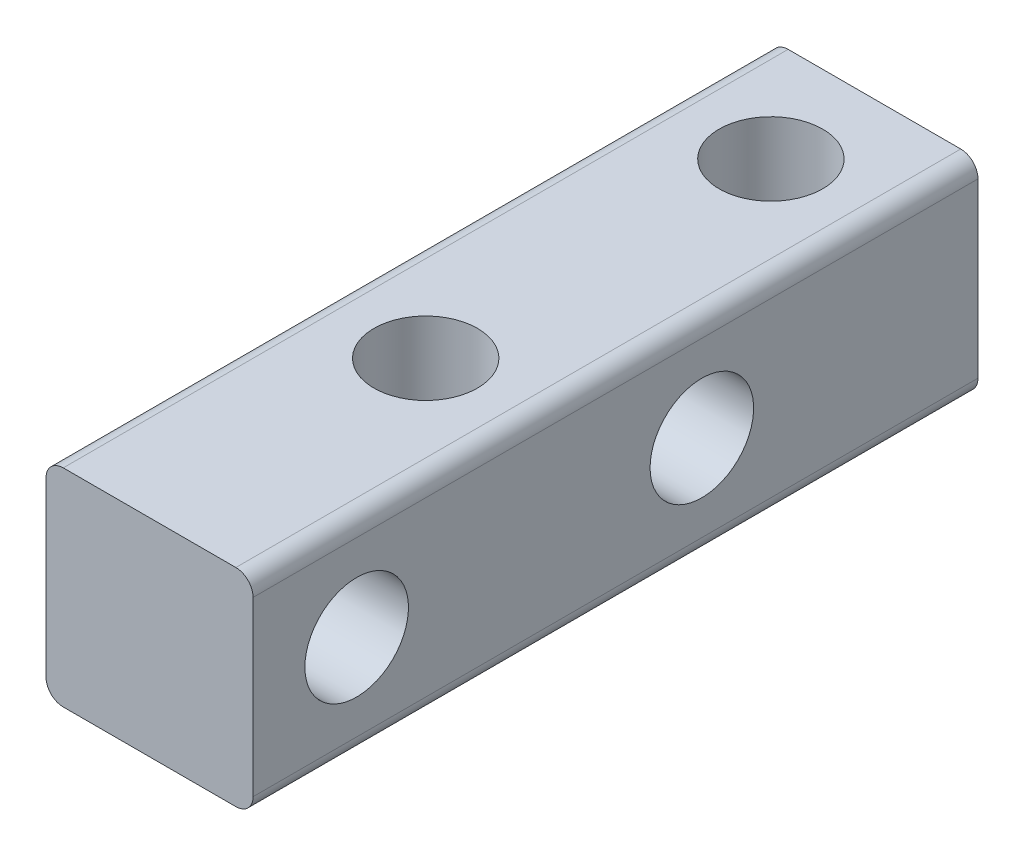
ISO-10303-21;
HEADER;
FILE_DESCRIPTION(('STEP AP214'),'2;1');
FILE_NAME('part.step','',(''),(''),'','','');
FILE_SCHEMA(('AUTOMOTIVE_DESIGN { 1 0 10303 214 1 1 1 1 }'));
ENDSEC;
DATA;
#1=APPLICATION_CONTEXT('core data for automotive mechanical design processes');
#2=APPLICATION_PROTOCOL_DEFINITION('international standard','automotive_design',2000,#1);
#3=PRODUCT_CONTEXT('',#1,'mechanical');
#4=PRODUCT('Part','Part','',(#3));
#5=PRODUCT_RELATED_PRODUCT_CATEGORY('part','',(#4));
#6=PRODUCT_DEFINITION_FORMATION('','',#4);
#7=PRODUCT_DEFINITION_CONTEXT('part definition',#1,'design');
#8=PRODUCT_DEFINITION('design','',#6,#7);
#9=PRODUCT_DEFINITION_SHAPE('','',#8);
#10=(LENGTH_UNIT() NAMED_UNIT(*) SI_UNIT(.MILLI.,.METRE.));
#11=(NAMED_UNIT(*) PLANE_ANGLE_UNIT() SI_UNIT($,.RADIAN.));
#12=(NAMED_UNIT(*) SI_UNIT($,.STERADIAN.) SOLID_ANGLE_UNIT());
#13=UNCERTAINTY_MEASURE_WITH_UNIT(LENGTH_MEASURE(1.E-05),#10,'distance_accuracy_value','');
#14=(GEOMETRIC_REPRESENTATION_CONTEXT(3) GLOBAL_UNCERTAINTY_ASSIGNED_CONTEXT((#13)) GLOBAL_UNIT_ASSIGNED_CONTEXT((#10,
#11,#12)) REPRESENTATION_CONTEXT('',''));
#15=CARTESIAN_POINT('',(0.,0.,0.));
#16=DIRECTION('',(0.,0.,1.));
#17=DIRECTION('',(1.,0.,0.));
#18=AXIS2_PLACEMENT_3D('',#15,#16,#17);
#19=CARTESIAN_POINT('',(3.,-3.,21.));
#20=DIRECTION('',(-1.,0.,0.));
#21=DIRECTION('',(0.,0.,1.));
#22=AXIS2_PLACEMENT_3D('',#19,#20,#21);
#23=PLANE('',#22);
#24=CARTESIAN_POINT('',(3.,0.,18.));
#25=DIRECTION('',(-1.,0.,0.));
#26=DIRECTION('',(0.,0.,1.));
#27=AXIS2_PLACEMENT_3D('',#24,#25,#26);
#28=CIRCLE('',#27,1.5);
#29=CARTESIAN_POINT('',(3.,0.,19.5));
#30=VERTEX_POINT('',#29);
#31=EDGE_CURVE('E160',#30,#30,#28,.F.);
#32=ORIENTED_EDGE('',*,*,#31,.F.);
#33=EDGE_LOOP('',(#32));
#34=FACE_BOUND('',#33,.T.);
#35=CARTESIAN_POINT('',(3.,0.,8.));
#36=DIRECTION('',(-1.,0.,0.));
#37=DIRECTION('',(0.,0.,1.));
#38=AXIS2_PLACEMENT_3D('',#35,#36,#37);
#39=CIRCLE('',#38,1.5);
#40=CARTESIAN_POINT('',(3.,0.,9.5));
#41=VERTEX_POINT('',#40);
#42=EDGE_CURVE('E166',#41,#41,#39,.F.);
#43=ORIENTED_EDGE('',*,*,#42,.F.);
#44=EDGE_LOOP('',(#43));
#45=FACE_BOUND('',#44,.T.);
#46=DIRECTION('',(0.,1.,0.));
#47=VECTOR('',#46,1.);
#48=CARTESIAN_POINT('',(3.,-3.,21.));
#49=LINE('',#48,#47);
#50=CARTESIAN_POINT('',(3.,-2.5,21.));
#51=VERTEX_POINT('',#50);
#52=CARTESIAN_POINT('',(3.,2.5,21.));
#53=VERTEX_POINT('',#52);
#54=EDGE_CURVE('E134',#51,#53,#49,.T.);
#55=ORIENTED_EDGE('',*,*,#54,.F.);
#56=DIRECTION('',(0.,0.,-1.));
#57=VECTOR('',#56,1.);
#58=CARTESIAN_POINT('',(3.,-2.5,21.));
#59=LINE('',#58,#57);
#60=CARTESIAN_POINT('',(3.,-2.5,0.));
#61=VERTEX_POINT('',#60);
#62=EDGE_CURVE('E119',#51,#61,#59,.T.);
#63=ORIENTED_EDGE('',*,*,#62,.T.);
#64=DIRECTION('',(0.,1.,0.));
#65=VECTOR('',#64,1.);
#66=CARTESIAN_POINT('',(3.,-3.,0.));
#67=LINE('',#66,#65);
#68=CARTESIAN_POINT('',(3.,2.5,0.));
#69=VERTEX_POINT('',#68);
#70=EDGE_CURVE('E131',#61,#69,#67,.T.);
#71=ORIENTED_EDGE('',*,*,#70,.T.);
#72=DIRECTION('',(0.,0.,-1.));
#73=VECTOR('',#72,1.);
#74=CARTESIAN_POINT('',(3.,2.5,21.));
#75=LINE('',#74,#73);
#76=EDGE_CURVE('E136',#69,#53,#75,.F.);
#77=ORIENTED_EDGE('',*,*,#76,.T.);
#78=EDGE_LOOP('',(#55,#63,#71,#77));
#79=FACE_BOUND('',#78,.T.);
#80=ADVANCED_FACE('F49',(#34,#45,#79),#23,.F.);
#81=CARTESIAN_POINT('',(-3.,3.,21.));
#82=DIRECTION('',(0.,-1.,0.));
#83=DIRECTION('',(0.,0.,-1.));
#84=AXIS2_PLACEMENT_3D('',#81,#82,#83);
#85=PLANE('',#84);
#86=CARTESIAN_POINT('',(0.,3.,3.));
#87=DIRECTION('',(0.,-1.,0.));
#88=DIRECTION('',(0.,0.,-1.));
#89=AXIS2_PLACEMENT_3D('',#86,#87,#88);
#90=CIRCLE('',#89,1.5);
#91=CARTESIAN_POINT('',(0.,3.,1.5));
#92=VERTEX_POINT('',#91);
#93=EDGE_CURVE('E141',#92,#92,#90,.F.);
#94=ORIENTED_EDGE('',*,*,#93,.F.);
#95=EDGE_LOOP('',(#94));
#96=FACE_BOUND('',#95,.T.);
#97=CARTESIAN_POINT('',(0.,3.,13.));
#98=DIRECTION('',(0.,-1.,0.));
#99=DIRECTION('',(0.,0.,-1.));
#100=AXIS2_PLACEMENT_3D('',#97,#98,#99);
#101=CIRCLE('',#100,1.5);
#102=CARTESIAN_POINT('',(0.,3.,11.5));
#103=VERTEX_POINT('',#102);
#104=EDGE_CURVE('E159',#103,#103,#101,.F.);
#105=ORIENTED_EDGE('',*,*,#104,.F.);
#106=EDGE_LOOP('',(#105));
#107=FACE_BOUND('',#106,.T.);
#108=DIRECTION('',(-1.,0.,0.));
#109=VECTOR('',#108,1.);
#110=CARTESIAN_POINT('',(-3.,3.,0.));
#111=LINE('',#110,#109);
#112=CARTESIAN_POINT('',(2.5,3.,0.));
#113=VERTEX_POINT('',#112);
#114=CARTESIAN_POINT('',(-2.5,3.,0.));
#115=VERTEX_POINT('',#114);
#116=EDGE_CURVE('E140',#113,#115,#111,.T.);
#117=ORIENTED_EDGE('',*,*,#116,.T.);
#118=DIRECTION('',(0.,0.,-1.));
#119=VECTOR('',#118,1.);
#120=CARTESIAN_POINT('',(-2.5,3.,21.));
#121=LINE('',#120,#119);
#122=CARTESIAN_POINT('',(-2.5,3.,21.));
#123=VERTEX_POINT('',#122);
#124=EDGE_CURVE('E11',#115,#123,#121,.F.);
#125=ORIENTED_EDGE('',*,*,#124,.T.);
#126=DIRECTION('',(-1.,0.,0.));
#127=VECTOR('',#126,1.);
#128=CARTESIAN_POINT('',(-3.,3.,21.));
#129=LINE('',#128,#127);
#130=CARTESIAN_POINT('',(2.5,3.,21.));
#131=VERTEX_POINT('',#130);
#132=EDGE_CURVE('E194',#131,#123,#129,.T.);
#133=ORIENTED_EDGE('',*,*,#132,.F.);
#134=DIRECTION('',(0.,0.,-1.));
#135=VECTOR('',#134,1.);
#136=CARTESIAN_POINT('',(2.5,3.,21.));
#137=LINE('',#136,#135);
#138=EDGE_CURVE('E57',#131,#113,#137,.T.);
#139=ORIENTED_EDGE('',*,*,#138,.T.);
#140=EDGE_LOOP('',(#117,#125,#133,#139));
#141=FACE_BOUND('',#140,.T.);
#142=ADVANCED_FACE('F192',(#96,#107,#141),#85,.F.);
#143=CARTESIAN_POINT('',(-3.,-3.,21.));
#144=DIRECTION('',(1.,0.,0.));
#145=DIRECTION('',(0.,0.,-1.));
#146=AXIS2_PLACEMENT_3D('',#143,#144,#145);
#147=PLANE('',#146);
#148=CARTESIAN_POINT('',(-3.,0.,18.));
#149=DIRECTION('',(1.,0.,0.));
#150=DIRECTION('',(0.,0.,-1.));
#151=AXIS2_PLACEMENT_3D('',#148,#149,#150);
#152=CIRCLE('',#151,1.5);
#153=CARTESIAN_POINT('',(-3.,0.,19.5));
#154=VERTEX_POINT('',#153);
#155=EDGE_CURVE('E167',#154,#154,#152,.F.);
#156=ORIENTED_EDGE('',*,*,#155,.F.);
#157=EDGE_LOOP('',(#156));
#158=FACE_BOUND('',#157,.T.);
#159=CARTESIAN_POINT('',(-3.,0.,8.));
#160=DIRECTION('',(1.,0.,0.));
#161=DIRECTION('',(0.,0.,-1.));
#162=AXIS2_PLACEMENT_3D('',#159,#160,#161);
#163=CIRCLE('',#162,1.5);
#164=CARTESIAN_POINT('',(-3.,0.,9.5));
#165=VERTEX_POINT('',#164);
#166=EDGE_CURVE('E163',#165,#165,#163,.F.);
#167=ORIENTED_EDGE('',*,*,#166,.F.);
#168=EDGE_LOOP('',(#167));
#169=FACE_BOUND('',#168,.T.);
#170=DIRECTION('',(0.,-1.,0.));
#171=VECTOR('',#170,1.);
#172=CARTESIAN_POINT('',(-3.,-3.,0.));
#173=LINE('',#172,#171);
#174=CARTESIAN_POINT('',(-3.,2.5,0.));
#175=VERTEX_POINT('',#174);
#176=CARTESIAN_POINT('',(-3.,-2.5,0.));
#177=VERTEX_POINT('',#176);
#178=EDGE_CURVE('E144',#175,#177,#173,.T.);
#179=ORIENTED_EDGE('',*,*,#178,.T.);
#180=DIRECTION('',(0.,0.,-1.));
#181=VECTOR('',#180,1.);
#182=CARTESIAN_POINT('',(-3.,-2.5,21.));
#183=LINE('',#182,#181);
#184=CARTESIAN_POINT('',(-3.,-2.5,21.));
#185=VERTEX_POINT('',#184);
#186=EDGE_CURVE('E64',#177,#185,#183,.F.);
#187=ORIENTED_EDGE('',*,*,#186,.T.);
#188=DIRECTION('',(0.,-1.,0.));
#189=VECTOR('',#188,1.);
#190=CARTESIAN_POINT('',(-3.,-3.,21.));
#191=LINE('',#190,#189);
#192=CARTESIAN_POINT('',(-3.,2.5,21.));
#193=VERTEX_POINT('',#192);
#194=EDGE_CURVE('E202',#193,#185,#191,.T.);
#195=ORIENTED_EDGE('',*,*,#194,.F.);
#196=DIRECTION('',(0.,0.,-1.));
#197=VECTOR('',#196,1.);
#198=CARTESIAN_POINT('',(-3.,2.5,21.));
#199=LINE('',#198,#197);
#200=EDGE_CURVE('E185',#193,#175,#199,.T.);
#201=ORIENTED_EDGE('',*,*,#200,.T.);
#202=EDGE_LOOP('',(#179,#187,#195,#201));
#203=FACE_BOUND('',#202,.T.);
#204=ADVANCED_FACE('F201',(#158,#169,#203),#147,.F.);
#205=CARTESIAN_POINT('',(-3.,-3.,21.));
#206=DIRECTION('',(0.,1.,0.));
#207=DIRECTION('',(0.,0.,1.));
#208=AXIS2_PLACEMENT_3D('',#205,#206,#207);
#209=PLANE('',#208);
#210=CARTESIAN_POINT('',(0.,-3.,3.));
#211=DIRECTION('',(0.,1.,0.));
#212=DIRECTION('',(0.,0.,1.));
#213=AXIS2_PLACEMENT_3D('',#210,#211,#212);
#214=CIRCLE('',#213,1.5);
#215=CARTESIAN_POINT('',(0.,-3.,1.5));
#216=VERTEX_POINT('',#215);
#217=EDGE_CURVE('E147',#216,#216,#214,.F.);
#218=ORIENTED_EDGE('',*,*,#217,.F.);
#219=EDGE_LOOP('',(#218));
#220=FACE_BOUND('',#219,.T.);
#221=CARTESIAN_POINT('',(0.,-3.,13.));
#222=DIRECTION('',(0.,1.,0.));
#223=DIRECTION('',(0.,0.,1.));
#224=AXIS2_PLACEMENT_3D('',#221,#222,#223);
#225=CIRCLE('',#224,1.5);
#226=CARTESIAN_POINT('',(0.,-3.,11.5));
#227=VERTEX_POINT('',#226);
#228=EDGE_CURVE('E156',#227,#227,#225,.F.);
#229=ORIENTED_EDGE('',*,*,#228,.F.);
#230=EDGE_LOOP('',(#229));
#231=FACE_BOUND('',#230,.T.);
#232=DIRECTION('',(1.,0.,0.));
#233=VECTOR('',#232,1.);
#234=CARTESIAN_POINT('',(-3.,-3.,0.));
#235=LINE('',#234,#233);
#236=CARTESIAN_POINT('',(-2.5,-3.,0.));
#237=VERTEX_POINT('',#236);
#238=CARTESIAN_POINT('',(2.5,-3.,0.));
#239=VERTEX_POINT('',#238);
#240=EDGE_CURVE('E154',#237,#239,#235,.T.);
#241=ORIENTED_EDGE('',*,*,#240,.T.);
#242=DIRECTION('',(0.,0.,-1.));
#243=VECTOR('',#242,1.);
#244=CARTESIAN_POINT('',(2.5,-3.,21.));
#245=LINE('',#244,#243);
#246=CARTESIAN_POINT('',(2.5,-3.,21.));
#247=VERTEX_POINT('',#246);
#248=EDGE_CURVE('E120',#239,#247,#245,.F.);
#249=ORIENTED_EDGE('',*,*,#248,.T.);
#250=DIRECTION('',(1.,0.,0.));
#251=VECTOR('',#250,1.);
#252=CARTESIAN_POINT('',(-3.,-3.,21.));
#253=LINE('',#252,#251);
#254=CARTESIAN_POINT('',(-2.5,-3.,21.));
#255=VERTEX_POINT('',#254);
#256=EDGE_CURVE('E150',#255,#247,#253,.T.);
#257=ORIENTED_EDGE('',*,*,#256,.F.);
#258=DIRECTION('',(0.,0.,-1.));
#259=VECTOR('',#258,1.);
#260=CARTESIAN_POINT('',(-2.5,-3.,21.));
#261=LINE('',#260,#259);
#262=EDGE_CURVE('E125',#255,#237,#261,.T.);
#263=ORIENTED_EDGE('',*,*,#262,.T.);
#264=EDGE_LOOP('',(#241,#249,#257,#263));
#265=FACE_BOUND('',#264,.T.);
#266=ADVANCED_FACE('F245',(#220,#231,#265),#209,.F.);
#267=CARTESIAN_POINT('',(0.,0.,21.));
#268=DIRECTION('',(0.,0.,-1.));
#269=DIRECTION('',(-1.,0.,0.));
#270=AXIS2_PLACEMENT_3D('',#267,#268,#269);
#271=PLANE('',#270);
#272=ORIENTED_EDGE('',*,*,#256,.T.);
#273=CARTESIAN_POINT('',(2.5,-2.5,21.));
#274=DIRECTION('',(0.,0.,-1.));
#275=DIRECTION('',(-1.,0.,0.));
#276=AXIS2_PLACEMENT_3D('',#273,#274,#275);
#277=CIRCLE('',#276,0.5);
#278=EDGE_CURVE('E183',#247,#51,#277,.F.);
#279=ORIENTED_EDGE('',*,*,#278,.T.);
#280=ORIENTED_EDGE('',*,*,#54,.T.);
#281=CARTESIAN_POINT('',(2.5,2.5,21.));
#282=DIRECTION('',(0.,0.,-1.));
#283=DIRECTION('',(-1.,0.,0.));
#284=AXIS2_PLACEMENT_3D('',#281,#282,#283);
#285=CIRCLE('',#284,0.5);
#286=EDGE_CURVE('E178',#53,#131,#285,.F.);
#287=ORIENTED_EDGE('',*,*,#286,.T.);
#288=ORIENTED_EDGE('',*,*,#132,.T.);
#289=CARTESIAN_POINT('',(-2.5,2.5,21.));
#290=DIRECTION('',(0.,0.,-1.));
#291=DIRECTION('',(-1.,0.,0.));
#292=AXIS2_PLACEMENT_3D('',#289,#290,#291);
#293=CIRCLE('',#292,0.5);
#294=EDGE_CURVE('E71',#123,#193,#293,.F.);
#295=ORIENTED_EDGE('',*,*,#294,.T.);
#296=ORIENTED_EDGE('',*,*,#194,.T.);
#297=CARTESIAN_POINT('',(-2.5,-2.5,21.));
#298=DIRECTION('',(0.,0.,-1.));
#299=DIRECTION('',(-1.,0.,0.));
#300=AXIS2_PLACEMENT_3D('',#297,#298,#299);
#301=CIRCLE('',#300,0.5);
#302=EDGE_CURVE('E181',#185,#255,#301,.F.);
#303=ORIENTED_EDGE('',*,*,#302,.T.);
#304=EDGE_LOOP('',(#272,#279,#280,#287,#288,#295,#296,#303));
#305=FACE_BOUND('',#304,.T.);
#306=ADVANCED_FACE('F241',(#305),#271,.F.);
#307=CARTESIAN_POINT('',(0.,0.,0.));
#308=DIRECTION('',(0.,0.,-1.));
#309=DIRECTION('',(-1.,0.,0.));
#310=AXIS2_PLACEMENT_3D('',#307,#308,#309);
#311=PLANE('',#310);
#312=ORIENTED_EDGE('',*,*,#70,.F.);
#313=CARTESIAN_POINT('',(2.5,-2.5,0.));
#314=DIRECTION('',(0.,0.,-1.));
#315=DIRECTION('',(-1.,0.,0.));
#316=AXIS2_PLACEMENT_3D('',#313,#314,#315);
#317=CIRCLE('',#316,0.5);
#318=EDGE_CURVE('E115',#61,#239,#317,.T.);
#319=ORIENTED_EDGE('',*,*,#318,.T.);
#320=ORIENTED_EDGE('',*,*,#240,.F.);
#321=CARTESIAN_POINT('',(-2.5,-2.5,0.));
#322=DIRECTION('',(0.,0.,-1.));
#323=DIRECTION('',(-1.,0.,0.));
#324=AXIS2_PLACEMENT_3D('',#321,#322,#323);
#325=CIRCLE('',#324,0.5);
#326=EDGE_CURVE('E126',#237,#177,#325,.T.);
#327=ORIENTED_EDGE('',*,*,#326,.T.);
#328=ORIENTED_EDGE('',*,*,#178,.F.);
#329=CARTESIAN_POINT('',(-2.5,2.5,0.));
#330=DIRECTION('',(0.,0.,-1.));
#331=DIRECTION('',(-1.,0.,0.));
#332=AXIS2_PLACEMENT_3D('',#329,#330,#331);
#333=CIRCLE('',#332,0.5);
#334=EDGE_CURVE('E172',#175,#115,#333,.T.);
#335=ORIENTED_EDGE('',*,*,#334,.T.);
#336=ORIENTED_EDGE('',*,*,#116,.F.);
#337=CARTESIAN_POINT('',(2.5,2.5,0.));
#338=DIRECTION('',(0.,0.,-1.));
#339=DIRECTION('',(-1.,0.,0.));
#340=AXIS2_PLACEMENT_3D('',#337,#338,#339);
#341=CIRCLE('',#340,0.5);
#342=EDGE_CURVE('E135',#113,#69,#341,.T.);
#343=ORIENTED_EDGE('',*,*,#342,.T.);
#344=EDGE_LOOP('',(#312,#319,#320,#327,#328,#335,#336,#343));
#345=FACE_BOUND('',#344,.T.);
#346=ADVANCED_FACE('F138',(#345),#311,.T.);
#347=CARTESIAN_POINT('',(0.,21.,13.));
#348=DIRECTION('',(0.,-1.,0.));
#349=DIRECTION('',(0.,0.,-1.));
#350=AXIS2_PLACEMENT_3D('',#347,#348,#349);
#351=CYLINDRICAL_SURFACE('',#350,1.5);
#352=CARTESIAN_POINT('',(0.,-3.,11.5));
#353=CARTESIAN_POINT('',(0.,-2.9375,11.5));
#354=CARTESIAN_POINT('',(0.,-2.875,11.5));
#355=CARTESIAN_POINT('',(0.,-2.75,11.5));
#356=CARTESIAN_POINT('',(0.,-2.6875,11.5));
#357=CARTESIAN_POINT('',(0.,-2.5625,11.5));
#358=CARTESIAN_POINT('',(0.,-2.5,11.5));
#359=CARTESIAN_POINT('',(0.,-2.375,11.5));
#360=CARTESIAN_POINT('',(0.,-2.3125,11.5));
#361=CARTESIAN_POINT('',(0.,-2.1875,11.5));
#362=CARTESIAN_POINT('',(0.,-2.125,11.5));
#363=CARTESIAN_POINT('',(0.,-2.,11.5));
#364=CARTESIAN_POINT('',(0.,-1.9375,11.5));
#365=CARTESIAN_POINT('',(0.,-1.8125,11.5));
#366=CARTESIAN_POINT('',(0.,-1.75,11.5));
#367=CARTESIAN_POINT('',(0.,-1.625,11.5));
#368=CARTESIAN_POINT('',(0.,-1.5625,11.5));
#369=CARTESIAN_POINT('',(0.,-1.4375,11.5));
#370=CARTESIAN_POINT('',(0.,-1.375,11.5));
#371=CARTESIAN_POINT('',(0.,-1.25,11.5));
#372=CARTESIAN_POINT('',(0.,-1.1875,11.5));
#373=CARTESIAN_POINT('',(0.,-1.0625,11.5));
#374=CARTESIAN_POINT('',(0.,-1.,11.5));
#375=CARTESIAN_POINT('',(0.,-0.875000000000001,11.5));
#376=CARTESIAN_POINT('',(0.,-0.812500000000001,11.5));
#377=CARTESIAN_POINT('',(0.,-0.687500000000001,11.5));
#378=CARTESIAN_POINT('',(0.,-0.625000000000001,11.5));
#379=CARTESIAN_POINT('',(0.,-0.5,11.5));
#380=CARTESIAN_POINT('',(0.,-0.4375,11.5));
#381=CARTESIAN_POINT('',(0.,-0.3125,11.5));
#382=CARTESIAN_POINT('',(0.,-0.25,11.5));
#383=CARTESIAN_POINT('',(0.,-0.125,11.5));
#384=CARTESIAN_POINT('',(0.,-0.0625000000000001,11.5));
#385=CARTESIAN_POINT('',(0.,0.0625000000000001,11.5));
#386=CARTESIAN_POINT('',(0.,0.125,11.5));
#387=CARTESIAN_POINT('',(0.,0.25,11.5));
#388=CARTESIAN_POINT('',(0.,0.3125,11.5));
#389=CARTESIAN_POINT('',(0.,0.4375,11.5));
#390=CARTESIAN_POINT('',(0.,0.5,11.5));
#391=CARTESIAN_POINT('',(0.,0.625000000000001,11.5));
#392=CARTESIAN_POINT('',(0.,0.687500000000001,11.5));
#393=CARTESIAN_POINT('',(0.,0.812500000000001,11.5));
#394=CARTESIAN_POINT('',(0.,0.875000000000001,11.5));
#395=CARTESIAN_POINT('',(0.,1.,11.5));
#396=CARTESIAN_POINT('',(0.,1.0625,11.5));
#397=CARTESIAN_POINT('',(0.,1.1875,11.5));
#398=CARTESIAN_POINT('',(0.,1.25,11.5));
#399=CARTESIAN_POINT('',(0.,1.375,11.5));
#400=CARTESIAN_POINT('',(0.,1.4375,11.5));
#401=CARTESIAN_POINT('',(0.,1.5625,11.5));
#402=CARTESIAN_POINT('',(0.,1.625,11.5));
#403=CARTESIAN_POINT('',(0.,1.75,11.5));
#404=CARTESIAN_POINT('',(0.,1.8125,11.5));
#405=CARTESIAN_POINT('',(0.,1.9375,11.5));
#406=CARTESIAN_POINT('',(0.,2.,11.5));
#407=CARTESIAN_POINT('',(0.,2.125,11.5));
#408=CARTESIAN_POINT('',(0.,2.1875,11.5));
#409=CARTESIAN_POINT('',(0.,2.3125,11.5));
#410=CARTESIAN_POINT('',(0.,2.375,11.5));
#411=CARTESIAN_POINT('',(0.,2.5,11.5));
#412=CARTESIAN_POINT('',(0.,2.5625,11.5));
#413=CARTESIAN_POINT('',(0.,2.6875,11.5));
#414=CARTESIAN_POINT('',(0.,2.75,11.5));
#415=CARTESIAN_POINT('',(0.,2.875,11.5));
#416=CARTESIAN_POINT('',(0.,2.9375,11.5));
#417=CARTESIAN_POINT('',(0.,3.,11.5));
#418=B_SPLINE_CURVE_WITH_KNOTS('',3,(#352,#353,#354,#355,#356,#357,#358,#359,#360,#361,#362,
#363,#364,#365,#366,#367,#368,#369,#370,#371,#372,#373,#374,#375,#376,#377,#378,#379,#380,#381,
#382,#383,#384,#385,#386,#387,#388,#389,#390,#391,#392,#393,#394,#395,#396,#397,#398,#399,#400,
#401,#402,#403,#404,#405,#406,#407,#408,#409,#410,#411,#412,#413,#414,#415,#416,#417),
.UNSPECIFIED.,.F.,.F.,(4,2,2,2,2,2,2,2,2,2,2,2,2,2,2,2,2,2,2,2,2,2,2,2,2,2,2,2,2,2,2,2,4),(0.,
0.1875,0.375,0.5625,0.750000000000001,0.937500000000001,1.125,1.3125,1.5,1.6875,1.875,2.0625,
2.25,2.4375,2.625,2.8125,3.,3.1875,3.375,3.5625,3.75,3.9375,4.125,4.3125,4.5,4.6875,4.875,
5.0625,5.25,5.4375,5.62500000000001,5.81250000000001,6.00000000000001),.UNSPECIFIED.);
#419=EDGE_CURVE('BSEAM259',#227,#103,#418,.T.);
#420=ORIENTED_EDGE('',*,*,#228,.T.);
#421=ORIENTED_EDGE('',*,*,#104,.T.);
#422=ORIENTED_EDGE('',*,*,#419,.T.);
#423=ORIENTED_EDGE('',*,*,#419,.F.);
#424=EDGE_LOOP('',(#420,#422,#421,#423));
#425=FACE_BOUND('',#424,.T.);
#426=ADVANCED_FACE('F259',(#425),#351,.F.);
#427=CARTESIAN_POINT('',(0.,21.,3.));
#428=DIRECTION('',(0.,-1.,0.));
#429=DIRECTION('',(0.,0.,-1.));
#430=AXIS2_PLACEMENT_3D('',#427,#428,#429);
#431=CYLINDRICAL_SURFACE('',#430,1.5);
#432=CARTESIAN_POINT('',(0.,-3.,1.5));
#433=CARTESIAN_POINT('',(0.,-2.9375,1.5));
#434=CARTESIAN_POINT('',(0.,-2.875,1.5));
#435=CARTESIAN_POINT('',(0.,-2.75,1.5));
#436=CARTESIAN_POINT('',(0.,-2.6875,1.5));
#437=CARTESIAN_POINT('',(0.,-2.5625,1.5));
#438=CARTESIAN_POINT('',(0.,-2.5,1.5));
#439=CARTESIAN_POINT('',(0.,-2.375,1.5));
#440=CARTESIAN_POINT('',(0.,-2.3125,1.5));
#441=CARTESIAN_POINT('',(0.,-2.1875,1.5));
#442=CARTESIAN_POINT('',(0.,-2.125,1.5));
#443=CARTESIAN_POINT('',(0.,-2.,1.5));
#444=CARTESIAN_POINT('',(0.,-1.9375,1.5));
#445=CARTESIAN_POINT('',(0.,-1.8125,1.5));
#446=CARTESIAN_POINT('',(0.,-1.75,1.5));
#447=CARTESIAN_POINT('',(0.,-1.625,1.5));
#448=CARTESIAN_POINT('',(0.,-1.5625,1.5));
#449=CARTESIAN_POINT('',(0.,-1.4375,1.5));
#450=CARTESIAN_POINT('',(0.,-1.375,1.5));
#451=CARTESIAN_POINT('',(0.,-1.25,1.5));
#452=CARTESIAN_POINT('',(0.,-1.1875,1.5));
#453=CARTESIAN_POINT('',(0.,-1.0625,1.5));
#454=CARTESIAN_POINT('',(0.,-1.,1.5));
#455=CARTESIAN_POINT('',(0.,-0.875000000000001,1.5));
#456=CARTESIAN_POINT('',(0.,-0.812500000000001,1.5));
#457=CARTESIAN_POINT('',(0.,-0.687500000000001,1.5));
#458=CARTESIAN_POINT('',(0.,-0.625000000000001,1.5));
#459=CARTESIAN_POINT('',(0.,-0.5,1.5));
#460=CARTESIAN_POINT('',(0.,-0.4375,1.5));
#461=CARTESIAN_POINT('',(0.,-0.3125,1.5));
#462=CARTESIAN_POINT('',(0.,-0.25,1.5));
#463=CARTESIAN_POINT('',(0.,-0.125,1.5));
#464=CARTESIAN_POINT('',(0.,-0.0625000000000001,1.5));
#465=CARTESIAN_POINT('',(0.,0.0625000000000001,1.5));
#466=CARTESIAN_POINT('',(0.,0.125,1.5));
#467=CARTESIAN_POINT('',(0.,0.25,1.5));
#468=CARTESIAN_POINT('',(0.,0.3125,1.5));
#469=CARTESIAN_POINT('',(0.,0.4375,1.5));
#470=CARTESIAN_POINT('',(0.,0.5,1.5));
#471=CARTESIAN_POINT('',(0.,0.625000000000001,1.5));
#472=CARTESIAN_POINT('',(0.,0.687500000000001,1.5));
#473=CARTESIAN_POINT('',(0.,0.812500000000001,1.5));
#474=CARTESIAN_POINT('',(0.,0.875000000000001,1.5));
#475=CARTESIAN_POINT('',(0.,1.,1.5));
#476=CARTESIAN_POINT('',(0.,1.0625,1.5));
#477=CARTESIAN_POINT('',(0.,1.1875,1.5));
#478=CARTESIAN_POINT('',(0.,1.25,1.5));
#479=CARTESIAN_POINT('',(0.,1.375,1.5));
#480=CARTESIAN_POINT('',(0.,1.4375,1.5));
#481=CARTESIAN_POINT('',(0.,1.5625,1.5));
#482=CARTESIAN_POINT('',(0.,1.625,1.5));
#483=CARTESIAN_POINT('',(0.,1.75,1.5));
#484=CARTESIAN_POINT('',(0.,1.8125,1.5));
#485=CARTESIAN_POINT('',(0.,1.9375,1.5));
#486=CARTESIAN_POINT('',(0.,2.,1.5));
#487=CARTESIAN_POINT('',(0.,2.125,1.5));
#488=CARTESIAN_POINT('',(0.,2.1875,1.5));
#489=CARTESIAN_POINT('',(0.,2.3125,1.5));
#490=CARTESIAN_POINT('',(0.,2.375,1.5));
#491=CARTESIAN_POINT('',(0.,2.5,1.5));
#492=CARTESIAN_POINT('',(0.,2.5625,1.5));
#493=CARTESIAN_POINT('',(0.,2.6875,1.5));
#494=CARTESIAN_POINT('',(0.,2.75,1.5));
#495=CARTESIAN_POINT('',(0.,2.875,1.5));
#496=CARTESIAN_POINT('',(0.,2.9375,1.5));
#497=CARTESIAN_POINT('',(0.,3.,1.5));
#498=B_SPLINE_CURVE_WITH_KNOTS('',3,(#432,#433,#434,#435,#436,#437,#438,#439,#440,#441,#442,
#443,#444,#445,#446,#447,#448,#449,#450,#451,#452,#453,#454,#455,#456,#457,#458,#459,#460,#461,
#462,#463,#464,#465,#466,#467,#468,#469,#470,#471,#472,#473,#474,#475,#476,#477,#478,#479,#480,
#481,#482,#483,#484,#485,#486,#487,#488,#489,#490,#491,#492,#493,#494,#495,#496,#497),
.UNSPECIFIED.,.F.,.F.,(4,2,2,2,2,2,2,2,2,2,2,2,2,2,2,2,2,2,2,2,2,2,2,2,2,2,2,2,2,2,2,2,4),(0.,
0.1875,0.375,0.5625,0.750000000000001,0.937500000000001,1.125,1.3125,1.5,1.6875,1.875,2.0625,
2.25,2.4375,2.625,2.8125,3.,3.1875,3.375,3.5625,3.75,3.9375,4.125,4.3125,4.5,4.6875,4.875,
5.0625,5.25,5.4375,5.62500000000001,5.81250000000001,6.00000000000001),.UNSPECIFIED.);
#499=EDGE_CURVE('BSEAM263',#216,#92,#498,.T.);
#500=ORIENTED_EDGE('',*,*,#217,.T.);
#501=ORIENTED_EDGE('',*,*,#93,.T.);
#502=ORIENTED_EDGE('',*,*,#499,.T.);
#503=ORIENTED_EDGE('',*,*,#499,.F.);
#504=EDGE_LOOP('',(#500,#502,#501,#503));
#505=FACE_BOUND('',#504,.T.);
#506=ADVANCED_FACE('F263',(#505),#431,.F.);
#507=CARTESIAN_POINT('',(21.,0.,8.));
#508=DIRECTION('',(-1.,0.,0.));
#509=DIRECTION('',(0.,0.,1.));
#510=AXIS2_PLACEMENT_3D('',#507,#508,#509);
#511=CYLINDRICAL_SURFACE('',#510,1.5);
#512=CARTESIAN_POINT('',(-3.,0.,9.5));
#513=CARTESIAN_POINT('',(-2.9375,0.,9.5));
#514=CARTESIAN_POINT('',(-2.875,0.,9.5));
#515=CARTESIAN_POINT('',(-2.75,0.,9.5));
#516=CARTESIAN_POINT('',(-2.6875,0.,9.5));
#517=CARTESIAN_POINT('',(-2.5625,0.,9.5));
#518=CARTESIAN_POINT('',(-2.5,0.,9.5));
#519=CARTESIAN_POINT('',(-2.375,0.,9.5));
#520=CARTESIAN_POINT('',(-2.3125,0.,9.5));
#521=CARTESIAN_POINT('',(-2.1875,0.,9.5));
#522=CARTESIAN_POINT('',(-2.125,0.,9.5));
#523=CARTESIAN_POINT('',(-2.,0.,9.5));
#524=CARTESIAN_POINT('',(-1.9375,0.,9.5));
#525=CARTESIAN_POINT('',(-1.8125,0.,9.5));
#526=CARTESIAN_POINT('',(-1.75,0.,9.5));
#527=CARTESIAN_POINT('',(-1.625,0.,9.5));
#528=CARTESIAN_POINT('',(-1.5625,0.,9.5));
#529=CARTESIAN_POINT('',(-1.4375,0.,9.5));
#530=CARTESIAN_POINT('',(-1.375,0.,9.5));
#531=CARTESIAN_POINT('',(-1.25,0.,9.5));
#532=CARTESIAN_POINT('',(-1.1875,0.,9.5));
#533=CARTESIAN_POINT('',(-1.0625,0.,9.5));
#534=CARTESIAN_POINT('',(-1.,0.,9.5));
#535=CARTESIAN_POINT('',(-0.875000000000001,0.,9.5));
#536=CARTESIAN_POINT('',(-0.812500000000001,0.,9.5));
#537=CARTESIAN_POINT('',(-0.687500000000001,0.,9.5));
#538=CARTESIAN_POINT('',(-0.625000000000001,0.,9.5));
#539=CARTESIAN_POINT('',(-0.5,0.,9.5));
#540=CARTESIAN_POINT('',(-0.4375,0.,9.5));
#541=CARTESIAN_POINT('',(-0.3125,0.,9.5));
#542=CARTESIAN_POINT('',(-0.25,0.,9.5));
#543=CARTESIAN_POINT('',(-0.125,0.,9.5));
#544=CARTESIAN_POINT('',(-0.0625000000000001,0.,9.5));
#545=CARTESIAN_POINT('',(0.0625000000000001,0.,9.5));
#546=CARTESIAN_POINT('',(0.125,0.,9.5));
#547=CARTESIAN_POINT('',(0.25,0.,9.5));
#548=CARTESIAN_POINT('',(0.3125,0.,9.5));
#549=CARTESIAN_POINT('',(0.4375,0.,9.5));
#550=CARTESIAN_POINT('',(0.5,0.,9.5));
#551=CARTESIAN_POINT('',(0.625000000000001,0.,9.5));
#552=CARTESIAN_POINT('',(0.687500000000001,0.,9.5));
#553=CARTESIAN_POINT('',(0.812500000000001,0.,9.5));
#554=CARTESIAN_POINT('',(0.875000000000001,0.,9.5));
#555=CARTESIAN_POINT('',(1.,0.,9.5));
#556=CARTESIAN_POINT('',(1.0625,0.,9.5));
#557=CARTESIAN_POINT('',(1.1875,0.,9.5));
#558=CARTESIAN_POINT('',(1.25,0.,9.5));
#559=CARTESIAN_POINT('',(1.375,0.,9.5));
#560=CARTESIAN_POINT('',(1.4375,0.,9.5));
#561=CARTESIAN_POINT('',(1.5625,0.,9.5));
#562=CARTESIAN_POINT('',(1.625,0.,9.5));
#563=CARTESIAN_POINT('',(1.75,0.,9.5));
#564=CARTESIAN_POINT('',(1.8125,0.,9.5));
#565=CARTESIAN_POINT('',(1.9375,0.,9.5));
#566=CARTESIAN_POINT('',(2.,0.,9.5));
#567=CARTESIAN_POINT('',(2.125,0.,9.5));
#568=CARTESIAN_POINT('',(2.1875,0.,9.5));
#569=CARTESIAN_POINT('',(2.3125,0.,9.5));
#570=CARTESIAN_POINT('',(2.375,0.,9.5));
#571=CARTESIAN_POINT('',(2.5,0.,9.5));
#572=CARTESIAN_POINT('',(2.5625,0.,9.5));
#573=CARTESIAN_POINT('',(2.6875,0.,9.5));
#574=CARTESIAN_POINT('',(2.75,0.,9.5));
#575=CARTESIAN_POINT('',(2.875,0.,9.5));
#576=CARTESIAN_POINT('',(2.9375,0.,9.5));
#577=CARTESIAN_POINT('',(3.,0.,9.5));
#578=B_SPLINE_CURVE_WITH_KNOTS('',3,(#512,#513,#514,#515,#516,#517,#518,#519,#520,#521,#522,
#523,#524,#525,#526,#527,#528,#529,#530,#531,#532,#533,#534,#535,#536,#537,#538,#539,#540,#541,
#542,#543,#544,#545,#546,#547,#548,#549,#550,#551,#552,#553,#554,#555,#556,#557,#558,#559,#560,
#561,#562,#563,#564,#565,#566,#567,#568,#569,#570,#571,#572,#573,#574,#575,#576,#577),
.UNSPECIFIED.,.F.,.F.,(4,2,2,2,2,2,2,2,2,2,2,2,2,2,2,2,2,2,2,2,2,2,2,2,2,2,2,2,2,2,2,2,4),(0.,
0.1875,0.375,0.5625,0.750000000000001,0.937500000000001,1.125,1.3125,1.5,1.6875,1.875,2.0625,
2.25,2.4375,2.625,2.8125,3.,3.1875,3.375,3.5625,3.75,3.9375,4.125,4.3125,4.5,4.6875,4.875,
5.0625,5.25,5.4375,5.62500000000001,5.81250000000001,6.00000000000001),.UNSPECIFIED.);
#579=EDGE_CURVE('BSEAM215',#165,#41,#578,.T.);
#580=ORIENTED_EDGE('',*,*,#166,.T.);
#581=ORIENTED_EDGE('',*,*,#42,.T.);
#582=ORIENTED_EDGE('',*,*,#579,.T.);
#583=ORIENTED_EDGE('',*,*,#579,.F.);
#584=EDGE_LOOP('',(#580,#582,#581,#583));
#585=FACE_BOUND('',#584,.T.);
#586=ADVANCED_FACE('F215',(#585),#511,.F.);
#587=CARTESIAN_POINT('',(21.,0.,18.));
#588=DIRECTION('',(-1.,0.,0.));
#589=DIRECTION('',(0.,0.,1.));
#590=AXIS2_PLACEMENT_3D('',#587,#588,#589);
#591=CYLINDRICAL_SURFACE('',#590,1.5);
#592=CARTESIAN_POINT('',(-3.,0.,19.5));
#593=CARTESIAN_POINT('',(-2.9375,0.,19.5));
#594=CARTESIAN_POINT('',(-2.875,0.,19.5));
#595=CARTESIAN_POINT('',(-2.75,0.,19.5));
#596=CARTESIAN_POINT('',(-2.6875,0.,19.5));
#597=CARTESIAN_POINT('',(-2.5625,0.,19.5));
#598=CARTESIAN_POINT('',(-2.5,0.,19.5));
#599=CARTESIAN_POINT('',(-2.375,0.,19.5));
#600=CARTESIAN_POINT('',(-2.3125,0.,19.5));
#601=CARTESIAN_POINT('',(-2.1875,0.,19.5));
#602=CARTESIAN_POINT('',(-2.125,0.,19.5));
#603=CARTESIAN_POINT('',(-2.,0.,19.5));
#604=CARTESIAN_POINT('',(-1.9375,0.,19.5));
#605=CARTESIAN_POINT('',(-1.8125,0.,19.5));
#606=CARTESIAN_POINT('',(-1.75,0.,19.5));
#607=CARTESIAN_POINT('',(-1.625,0.,19.5));
#608=CARTESIAN_POINT('',(-1.5625,0.,19.5));
#609=CARTESIAN_POINT('',(-1.4375,0.,19.5));
#610=CARTESIAN_POINT('',(-1.375,0.,19.5));
#611=CARTESIAN_POINT('',(-1.25,0.,19.5));
#612=CARTESIAN_POINT('',(-1.1875,0.,19.5));
#613=CARTESIAN_POINT('',(-1.0625,0.,19.5));
#614=CARTESIAN_POINT('',(-1.,0.,19.5));
#615=CARTESIAN_POINT('',(-0.875000000000001,0.,19.5));
#616=CARTESIAN_POINT('',(-0.812500000000001,0.,19.5));
#617=CARTESIAN_POINT('',(-0.687500000000001,0.,19.5));
#618=CARTESIAN_POINT('',(-0.625000000000001,0.,19.5));
#619=CARTESIAN_POINT('',(-0.5,0.,19.5));
#620=CARTESIAN_POINT('',(-0.4375,0.,19.5));
#621=CARTESIAN_POINT('',(-0.3125,0.,19.5));
#622=CARTESIAN_POINT('',(-0.25,0.,19.5));
#623=CARTESIAN_POINT('',(-0.125,0.,19.5));
#624=CARTESIAN_POINT('',(-0.0625000000000001,0.,19.5));
#625=CARTESIAN_POINT('',(0.0625000000000001,0.,19.5));
#626=CARTESIAN_POINT('',(0.125,0.,19.5));
#627=CARTESIAN_POINT('',(0.25,0.,19.5));
#628=CARTESIAN_POINT('',(0.3125,0.,19.5));
#629=CARTESIAN_POINT('',(0.4375,0.,19.5));
#630=CARTESIAN_POINT('',(0.5,0.,19.5));
#631=CARTESIAN_POINT('',(0.625000000000001,0.,19.5));
#632=CARTESIAN_POINT('',(0.687500000000001,0.,19.5));
#633=CARTESIAN_POINT('',(0.812500000000001,0.,19.5));
#634=CARTESIAN_POINT('',(0.875000000000001,0.,19.5));
#635=CARTESIAN_POINT('',(1.,0.,19.5));
#636=CARTESIAN_POINT('',(1.0625,0.,19.5));
#637=CARTESIAN_POINT('',(1.1875,0.,19.5));
#638=CARTESIAN_POINT('',(1.25,0.,19.5));
#639=CARTESIAN_POINT('',(1.375,0.,19.5));
#640=CARTESIAN_POINT('',(1.4375,0.,19.5));
#641=CARTESIAN_POINT('',(1.5625,0.,19.5));
#642=CARTESIAN_POINT('',(1.625,0.,19.5));
#643=CARTESIAN_POINT('',(1.75,0.,19.5));
#644=CARTESIAN_POINT('',(1.8125,0.,19.5));
#645=CARTESIAN_POINT('',(1.9375,0.,19.5));
#646=CARTESIAN_POINT('',(2.,0.,19.5));
#647=CARTESIAN_POINT('',(2.125,0.,19.5));
#648=CARTESIAN_POINT('',(2.1875,0.,19.5));
#649=CARTESIAN_POINT('',(2.3125,0.,19.5));
#650=CARTESIAN_POINT('',(2.375,0.,19.5));
#651=CARTESIAN_POINT('',(2.5,0.,19.5));
#652=CARTESIAN_POINT('',(2.5625,0.,19.5));
#653=CARTESIAN_POINT('',(2.6875,0.,19.5));
#654=CARTESIAN_POINT('',(2.75,0.,19.5));
#655=CARTESIAN_POINT('',(2.875,0.,19.5));
#656=CARTESIAN_POINT('',(2.9375,0.,19.5));
#657=CARTESIAN_POINT('',(3.,0.,19.5));
#658=B_SPLINE_CURVE_WITH_KNOTS('',3,(#592,#593,#594,#595,#596,#597,#598,#599,#600,#601,#602,
#603,#604,#605,#606,#607,#608,#609,#610,#611,#612,#613,#614,#615,#616,#617,#618,#619,#620,#621,
#622,#623,#624,#625,#626,#627,#628,#629,#630,#631,#632,#633,#634,#635,#636,#637,#638,#639,#640,
#641,#642,#643,#644,#645,#646,#647,#648,#649,#650,#651,#652,#653,#654,#655,#656,#657),
.UNSPECIFIED.,.F.,.F.,(4,2,2,2,2,2,2,2,2,2,2,2,2,2,2,2,2,2,2,2,2,2,2,2,2,2,2,2,2,2,2,2,4),(0.,
0.1875,0.375,0.5625,0.750000000000001,0.937500000000001,1.125,1.3125,1.5,1.6875,1.875,2.0625,
2.25,2.4375,2.625,2.8125,3.,3.1875,3.375,3.5625,3.75,3.9375,4.125,4.3125,4.5,4.6875,4.875,
5.0625,5.25,5.4375,5.62500000000001,5.81250000000001,6.00000000000001),.UNSPECIFIED.);
#659=EDGE_CURVE('BSEAM232',#154,#30,#658,.T.);
#660=ORIENTED_EDGE('',*,*,#155,.T.);
#661=ORIENTED_EDGE('',*,*,#31,.T.);
#662=ORIENTED_EDGE('',*,*,#659,.T.);
#663=ORIENTED_EDGE('',*,*,#659,.F.);
#664=EDGE_LOOP('',(#660,#662,#661,#663));
#665=FACE_BOUND('',#664,.T.);
#666=ADVANCED_FACE('F232',(#665),#591,.F.);
#667=CARTESIAN_POINT('',(2.5,-2.5,21.));
#668=DIRECTION('',(0.,0.,-1.));
#669=DIRECTION('',(-1.,0.,0.));
#670=AXIS2_PLACEMENT_3D('',#667,#668,#669);
#671=CYLINDRICAL_SURFACE('',#670,0.5);
#672=ORIENTED_EDGE('',*,*,#278,.F.);
#673=ORIENTED_EDGE('',*,*,#248,.F.);
#674=ORIENTED_EDGE('',*,*,#318,.F.);
#675=ORIENTED_EDGE('',*,*,#62,.F.);
#676=EDGE_LOOP('',(#672,#673,#674,#675));
#677=FACE_BOUND('',#676,.T.);
#678=ADVANCED_FACE('F118',(#677),#671,.T.);
#679=CARTESIAN_POINT('',(-2.5,-2.5,21.));
#680=DIRECTION('',(0.,0.,-1.));
#681=DIRECTION('',(-1.,0.,0.));
#682=AXIS2_PLACEMENT_3D('',#679,#680,#681);
#683=CYLINDRICAL_SURFACE('',#682,0.5);
#684=ORIENTED_EDGE('',*,*,#302,.F.);
#685=ORIENTED_EDGE('',*,*,#186,.F.);
#686=ORIENTED_EDGE('',*,*,#326,.F.);
#687=ORIENTED_EDGE('',*,*,#262,.F.);
#688=EDGE_LOOP('',(#684,#685,#686,#687));
#689=FACE_BOUND('',#688,.T.);
#690=ADVANCED_FACE('F231',(#689),#683,.T.);
#691=CARTESIAN_POINT('',(-2.5,2.5,21.));
#692=DIRECTION('',(0.,0.,-1.));
#693=DIRECTION('',(-1.,0.,0.));
#694=AXIS2_PLACEMENT_3D('',#691,#692,#693);
#695=CYLINDRICAL_SURFACE('',#694,0.5);
#696=ORIENTED_EDGE('',*,*,#294,.F.);
#697=ORIENTED_EDGE('',*,*,#124,.F.);
#698=ORIENTED_EDGE('',*,*,#334,.F.);
#699=ORIENTED_EDGE('',*,*,#200,.F.);
#700=EDGE_LOOP('',(#696,#697,#698,#699));
#701=FACE_BOUND('',#700,.T.);
#702=ADVANCED_FACE('F200',(#701),#695,.T.);
#703=CARTESIAN_POINT('',(2.5,2.5,21.));
#704=DIRECTION('',(0.,0.,-1.));
#705=DIRECTION('',(-1.,0.,0.));
#706=AXIS2_PLACEMENT_3D('',#703,#704,#705);
#707=CYLINDRICAL_SURFACE('',#706,0.5);
#708=ORIENTED_EDGE('',*,*,#286,.F.);
#709=ORIENTED_EDGE('',*,*,#76,.F.);
#710=ORIENTED_EDGE('',*,*,#342,.F.);
#711=ORIENTED_EDGE('',*,*,#138,.F.);
#712=EDGE_LOOP('',(#708,#709,#710,#711));
#713=FACE_BOUND('',#712,.T.);
#714=ADVANCED_FACE('F51',(#713),#707,.T.);
#715=CLOSED_SHELL('',(#80,#142,#204,#266,#306,#346,#426,#506,#586,#666,#678,#690,#702,#714));
#716=MANIFOLD_SOLID_BREP('B2',#715);
#717=ADVANCED_BREP_SHAPE_REPRESENTATION('',(#18,#716),#14);
#718=SHAPE_DEFINITION_REPRESENTATION(#9,#717);
ENDSEC;
END-ISO-10303-21;
